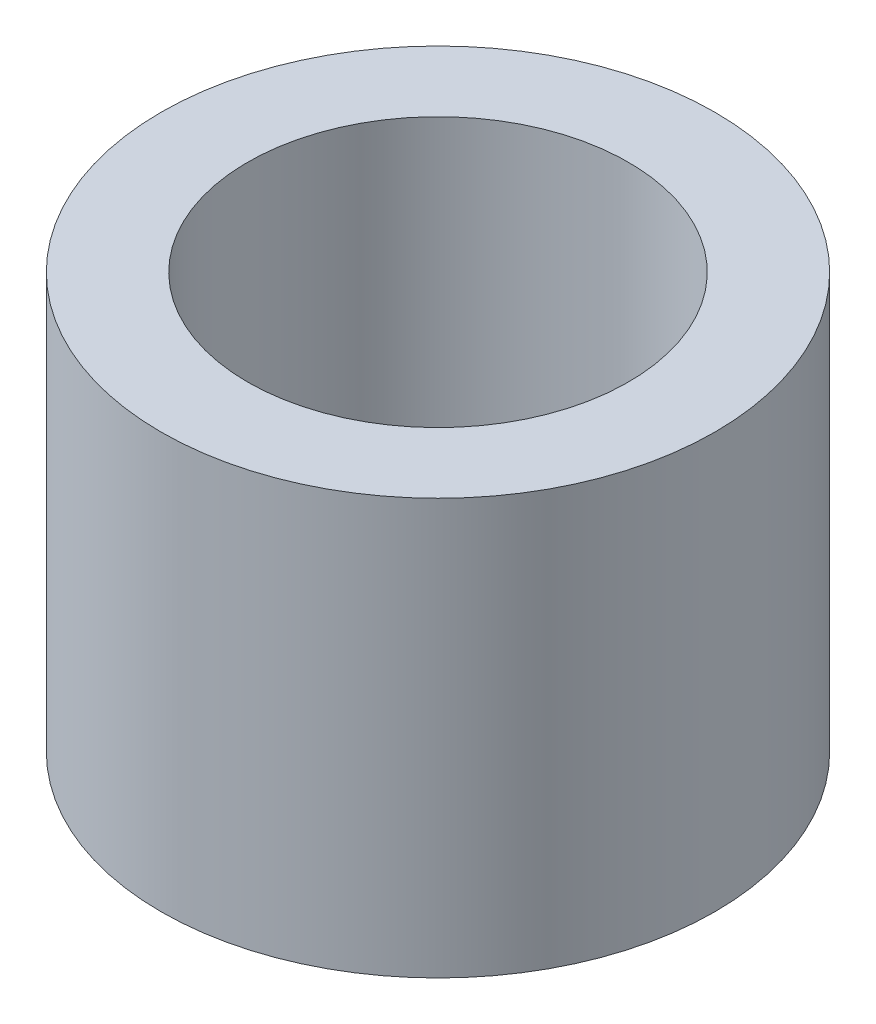
ISO-10303-21;
HEADER;
FILE_DESCRIPTION(('STEP AP214'),'2;1');
FILE_NAME('part.step','',(''),(''),'','','');
FILE_SCHEMA(('AUTOMOTIVE_DESIGN { 1 0 10303 214 1 1 1 1 }'));
ENDSEC;
DATA;
#1=APPLICATION_CONTEXT('core data for automotive mechanical design processes');
#2=APPLICATION_PROTOCOL_DEFINITION('international standard','automotive_design',2000,#1);
#3=PRODUCT_CONTEXT('',#1,'mechanical');
#4=PRODUCT('Part','Part','',(#3));
#5=PRODUCT_RELATED_PRODUCT_CATEGORY('part','',(#4));
#6=PRODUCT_DEFINITION_FORMATION('','',#4);
#7=PRODUCT_DEFINITION_CONTEXT('part definition',#1,'design');
#8=PRODUCT_DEFINITION('design','',#6,#7);
#9=PRODUCT_DEFINITION_SHAPE('','',#8);
#10=(LENGTH_UNIT() NAMED_UNIT(*) SI_UNIT(.MILLI.,.METRE.));
#11=(NAMED_UNIT(*) PLANE_ANGLE_UNIT() SI_UNIT($,.RADIAN.));
#12=(NAMED_UNIT(*) SI_UNIT($,.STERADIAN.) SOLID_ANGLE_UNIT());
#13=UNCERTAINTY_MEASURE_WITH_UNIT(LENGTH_MEASURE(1.E-05),#10,'distance_accuracy_value','');
#14=(GEOMETRIC_REPRESENTATION_CONTEXT(3) GLOBAL_UNCERTAINTY_ASSIGNED_CONTEXT((#13)) GLOBAL_UNIT_ASSIGNED_CONTEXT((#10,
#11,#12)) REPRESENTATION_CONTEXT('',''));
#15=CARTESIAN_POINT('',(0.,0.,0.));
#16=DIRECTION('',(0.,0.,1.));
#17=DIRECTION('',(1.,0.,0.));
#18=AXIS2_PLACEMENT_3D('',#15,#16,#17);
#19=CARTESIAN_POINT('',(0.,24.,0.));
#20=DIRECTION('',(0.,1.,0.));
#21=DIRECTION('',(0.,0.,1.));
#22=AXIS2_PLACEMENT_3D('',#19,#20,#21);
#23=PLANE('',#22);
#24=CARTESIAN_POINT('',(0.,24.,0.));
#25=DIRECTION('',(0.,1.,0.));
#26=DIRECTION('',(0.,0.,1.));
#27=AXIS2_PLACEMENT_3D('',#24,#25,#26);
#28=CIRCLE('',#27,16.);
#29=CARTESIAN_POINT('',(0.,24.,16.));
#30=VERTEX_POINT('',#29);
#31=EDGE_CURVE('E10',#30,#30,#28,.T.);
#32=ORIENTED_EDGE('',*,*,#31,.T.);
#33=EDGE_LOOP('',(#32));
#34=FACE_BOUND('',#33,.T.);
#35=CARTESIAN_POINT('',(0.,24.,0.));
#36=DIRECTION('',(0.,1.,0.));
#37=DIRECTION('',(0.,0.,1.));
#38=AXIS2_PLACEMENT_3D('',#35,#36,#37);
#39=CIRCLE('',#38,11.);
#40=CARTESIAN_POINT('',(0.,24.,11.));
#41=VERTEX_POINT('',#40);
#42=EDGE_CURVE('E50',#41,#41,#39,.T.);
#43=ORIENTED_EDGE('',*,*,#42,.F.);
#44=EDGE_LOOP('',(#43));
#45=FACE_BOUND('',#44,.T.);
#46=ADVANCED_FACE('F37',(#34,#45),#23,.T.);
#47=CARTESIAN_POINT('',(0.,0.,0.));
#48=DIRECTION('',(0.,1.,0.));
#49=DIRECTION('',(0.,0.,1.));
#50=AXIS2_PLACEMENT_3D('',#47,#48,#49);
#51=PLANE('',#50);
#52=CARTESIAN_POINT('',(0.,0.,0.));
#53=DIRECTION('',(0.,1.,0.));
#54=DIRECTION('',(0.,0.,1.));
#55=AXIS2_PLACEMENT_3D('',#52,#53,#54);
#56=CIRCLE('',#55,16.);
#57=CARTESIAN_POINT('',(0.,0.,16.));
#58=VERTEX_POINT('',#57);
#59=EDGE_CURVE('E41',#58,#58,#56,.T.);
#60=ORIENTED_EDGE('',*,*,#59,.F.);
#61=EDGE_LOOP('',(#60));
#62=FACE_BOUND('',#61,.T.);
#63=CARTESIAN_POINT('',(0.,0.,0.));
#64=DIRECTION('',(0.,1.,0.));
#65=DIRECTION('',(0.,0.,1.));
#66=AXIS2_PLACEMENT_3D('',#63,#64,#65);
#67=CIRCLE('',#66,11.);
#68=CARTESIAN_POINT('',(0.,0.,11.));
#69=VERTEX_POINT('',#68);
#70=EDGE_CURVE('E52',#69,#69,#67,.T.);
#71=ORIENTED_EDGE('',*,*,#70,.T.);
#72=EDGE_LOOP('',(#71));
#73=FACE_BOUND('',#72,.T.);
#74=ADVANCED_FACE('F64',(#62,#73),#51,.F.);
#75=CARTESIAN_POINT('',(0.,24.,0.));
#76=DIRECTION('',(0.,-1.,0.));
#77=DIRECTION('',(0.,0.,-1.));
#78=AXIS2_PLACEMENT_3D('',#75,#76,#77);
#79=CYLINDRICAL_SURFACE('',#78,16.);
#80=ORIENTED_EDGE('',*,*,#31,.F.);
#81=EDGE_LOOP('',(#80));
#82=FACE_BOUND('',#81,.T.);
#83=ORIENTED_EDGE('',*,*,#59,.T.);
#84=EDGE_LOOP('',(#83));
#85=FACE_BOUND('',#84,.T.);
#86=ADVANCED_FACE('F39',(#82,#85),#79,.T.);
#87=CARTESIAN_POINT('',(0.,24.,0.));
#88=DIRECTION('',(0.,-1.,0.));
#89=DIRECTION('',(0.,0.,-1.));
#90=AXIS2_PLACEMENT_3D('',#87,#88,#89);
#91=CYLINDRICAL_SURFACE('',#90,11.);
#92=ORIENTED_EDGE('',*,*,#42,.T.);
#93=EDGE_LOOP('',(#92));
#94=FACE_BOUND('',#93,.T.);
#95=ORIENTED_EDGE('',*,*,#70,.F.);
#96=EDGE_LOOP('',(#95));
#97=FACE_BOUND('',#96,.T.);
#98=ADVANCED_FACE('F60',(#94,#97),#91,.F.);
#99=CLOSED_SHELL('',(#46,#74,#86,#98));
#100=MANIFOLD_SOLID_BREP('B2',#99);
#101=ADVANCED_BREP_SHAPE_REPRESENTATION('',(#18,#100),#14);
#102=SHAPE_DEFINITION_REPRESENTATION(#9,#101);
ENDSEC;
END-ISO-10303-21;
